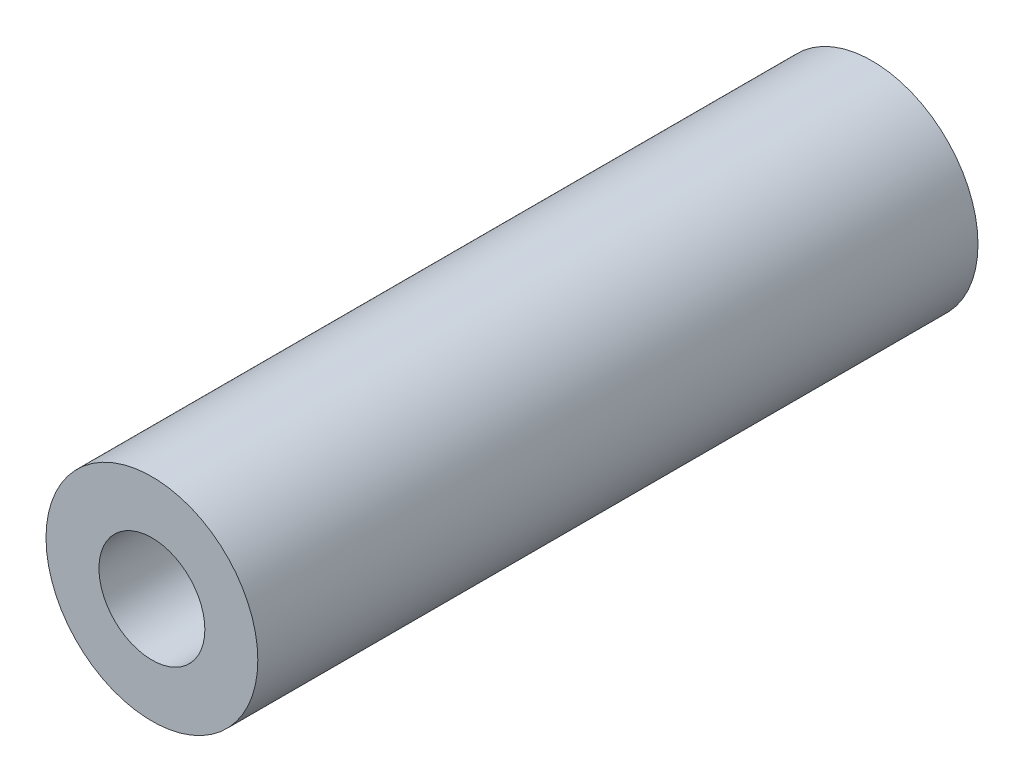
ISO-10303-21;
HEADER;
FILE_DESCRIPTION(('STEP AP214'),'2;1');
FILE_NAME('part.step','',(''),(''),'','','');
FILE_SCHEMA(('AUTOMOTIVE_DESIGN { 1 0 10303 214 1 1 1 1 }'));
ENDSEC;
DATA;
#1=APPLICATION_CONTEXT('core data for automotive mechanical design processes');
#2=APPLICATION_PROTOCOL_DEFINITION('international standard','automotive_design',2000,#1);
#3=PRODUCT_CONTEXT('',#1,'mechanical');
#4=PRODUCT('Part','Part','',(#3));
#5=PRODUCT_RELATED_PRODUCT_CATEGORY('part','',(#4));
#6=PRODUCT_DEFINITION_FORMATION('','',#4);
#7=PRODUCT_DEFINITION_CONTEXT('part definition',#1,'design');
#8=PRODUCT_DEFINITION('design','',#6,#7);
#9=PRODUCT_DEFINITION_SHAPE('','',#8);
#10=(LENGTH_UNIT() NAMED_UNIT(*) SI_UNIT(.MILLI.,.METRE.));
#11=(NAMED_UNIT(*) PLANE_ANGLE_UNIT() SI_UNIT($,.RADIAN.));
#12=(NAMED_UNIT(*) SI_UNIT($,.STERADIAN.) SOLID_ANGLE_UNIT());
#13=UNCERTAINTY_MEASURE_WITH_UNIT(LENGTH_MEASURE(1.E-05),#10,'distance_accuracy_value','');
#14=(GEOMETRIC_REPRESENTATION_CONTEXT(3) GLOBAL_UNCERTAINTY_ASSIGNED_CONTEXT((#13)) GLOBAL_UNIT_ASSIGNED_CONTEXT((#10,
#11,#12)) REPRESENTATION_CONTEXT('',''));
#15=CARTESIAN_POINT('',(0.,0.,0.));
#16=DIRECTION('',(0.,0.,1.));
#17=DIRECTION('',(1.,0.,0.));
#18=AXIS2_PLACEMENT_3D('',#15,#16,#17);
#19=CARTESIAN_POINT('',(0.,0.,-86.36));
#20=DIRECTION('',(0.,0.,1.));
#21=DIRECTION('',(1.,0.,0.));
#22=AXIS2_PLACEMENT_3D('',#19,#20,#21);
#23=CYLINDRICAL_SURFACE('',#22,12.7);
#24=CARTESIAN_POINT('',(0.,0.,-86.36));
#25=DIRECTION('',(0.,0.,1.));
#26=DIRECTION('',(1.,0.,0.));
#27=AXIS2_PLACEMENT_3D('',#24,#25,#26);
#28=CIRCLE('',#27,12.7);
#29=CARTESIAN_POINT('',(12.7,0.,-86.36));
#30=VERTEX_POINT('',#29);
#31=EDGE_CURVE('E10',#30,#30,#28,.T.);
#32=ORIENTED_EDGE('',*,*,#31,.T.);
#33=EDGE_LOOP('',(#32));
#34=FACE_BOUND('',#33,.T.);
#35=CARTESIAN_POINT('',(0.,0.,0.));
#36=DIRECTION('',(0.,0.,1.));
#37=DIRECTION('',(1.,0.,0.));
#38=AXIS2_PLACEMENT_3D('',#35,#36,#37);
#39=CIRCLE('',#38,12.7);
#40=CARTESIAN_POINT('',(12.7,0.,0.));
#41=VERTEX_POINT('',#40);
#42=EDGE_CURVE('E40',#41,#41,#39,.T.);
#43=ORIENTED_EDGE('',*,*,#42,.F.);
#44=EDGE_LOOP('',(#43));
#45=FACE_BOUND('',#44,.T.);
#46=ADVANCED_FACE('F37',(#34,#45),#23,.T.);
#47=CARTESIAN_POINT('',(0.,0.,-86.36));
#48=DIRECTION('',(0.,0.,1.));
#49=DIRECTION('',(1.,0.,0.));
#50=AXIS2_PLACEMENT_3D('',#47,#48,#49);
#51=PLANE('',#50);
#52=CARTESIAN_POINT('',(0.,0.,-86.36));
#53=DIRECTION('',(0.,0.,1.));
#54=DIRECTION('',(1.,0.,0.));
#55=AXIS2_PLACEMENT_3D('',#52,#53,#54);
#56=CIRCLE('',#55,6.35);
#57=CARTESIAN_POINT('',(6.35,0.,-86.36));
#58=VERTEX_POINT('',#57);
#59=EDGE_CURVE('E49',#58,#58,#56,.T.);
#60=ORIENTED_EDGE('',*,*,#59,.T.);
#61=EDGE_LOOP('',(#60));
#62=FACE_BOUND('',#61,.T.);
#63=ORIENTED_EDGE('',*,*,#31,.F.);
#64=EDGE_LOOP('',(#63));
#65=FACE_BOUND('',#64,.T.);
#66=ADVANCED_FACE('F59',(#62,#65),#51,.F.);
#67=CARTESIAN_POINT('',(0.,0.,0.));
#68=DIRECTION('',(0.,0.,1.));
#69=DIRECTION('',(1.,0.,0.));
#70=AXIS2_PLACEMENT_3D('',#67,#68,#69);
#71=PLANE('',#70);
#72=CARTESIAN_POINT('',(0.,0.,0.));
#73=DIRECTION('',(0.,0.,1.));
#74=DIRECTION('',(1.,0.,0.));
#75=AXIS2_PLACEMENT_3D('',#72,#73,#74);
#76=CIRCLE('',#75,6.35);
#77=CARTESIAN_POINT('',(6.35,0.,0.));
#78=VERTEX_POINT('',#77);
#79=EDGE_CURVE('E51',#78,#78,#76,.T.);
#80=ORIENTED_EDGE('',*,*,#79,.F.);
#81=EDGE_LOOP('',(#80));
#82=FACE_BOUND('',#81,.T.);
#83=ORIENTED_EDGE('',*,*,#42,.T.);
#84=EDGE_LOOP('',(#83));
#85=FACE_BOUND('',#84,.T.);
#86=ADVANCED_FACE('F65',(#82,#85),#71,.T.);
#87=CARTESIAN_POINT('',(0.,0.,-86.36));
#88=DIRECTION('',(0.,0.,1.));
#89=DIRECTION('',(1.,0.,0.));
#90=AXIS2_PLACEMENT_3D('',#87,#88,#89);
#91=CYLINDRICAL_SURFACE('',#90,6.35);
#92=ORIENTED_EDGE('',*,*,#59,.F.);
#93=EDGE_LOOP('',(#92));
#94=FACE_BOUND('',#93,.T.);
#95=ORIENTED_EDGE('',*,*,#79,.T.);
#96=EDGE_LOOP('',(#95));
#97=FACE_BOUND('',#96,.T.);
#98=ADVANCED_FACE('F62',(#94,#97),#91,.F.);
#99=CLOSED_SHELL('',(#46,#66,#86,#98));
#100=MANIFOLD_SOLID_BREP('B2',#99);
#101=ADVANCED_BREP_SHAPE_REPRESENTATION('',(#18,#100),#14);
#102=SHAPE_DEFINITION_REPRESENTATION(#9,#101);
ENDSEC;
END-ISO-10303-21;
